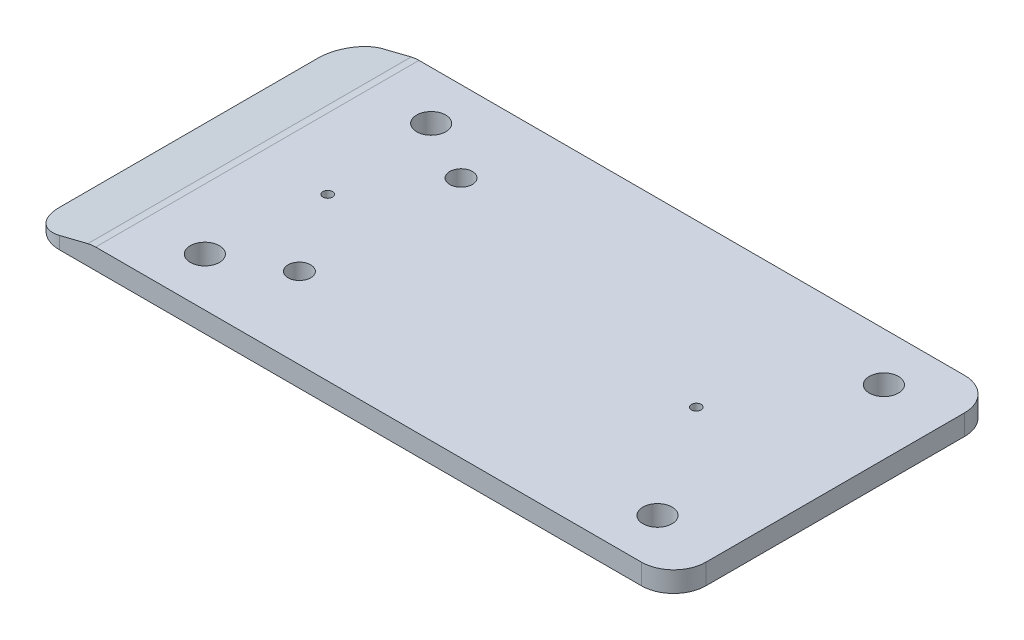
ISO-10303-21;
HEADER;
FILE_DESCRIPTION(('STEP AP214'),'2;1');
FILE_NAME('part.step','',(''),(''),'','','');
FILE_SCHEMA(('AUTOMOTIVE_DESIGN { 1 0 10303 214 1 1 1 1 }'));
ENDSEC;
DATA;
#1=APPLICATION_CONTEXT('core data for automotive mechanical design processes');
#2=APPLICATION_PROTOCOL_DEFINITION('international standard','automotive_design',2000,#1);
#3=PRODUCT_CONTEXT('',#1,'mechanical');
#4=PRODUCT('Part','Part','',(#3));
#5=PRODUCT_RELATED_PRODUCT_CATEGORY('part','',(#4));
#6=PRODUCT_DEFINITION_FORMATION('','',#4);
#7=PRODUCT_DEFINITION_CONTEXT('part definition',#1,'design');
#8=PRODUCT_DEFINITION('design','',#6,#7);
#9=PRODUCT_DEFINITION_SHAPE('','',#8);
#10=(LENGTH_UNIT() NAMED_UNIT(*) SI_UNIT(.MILLI.,.METRE.));
#11=(NAMED_UNIT(*) PLANE_ANGLE_UNIT() SI_UNIT($,.RADIAN.));
#12=(NAMED_UNIT(*) SI_UNIT($,.STERADIAN.) SOLID_ANGLE_UNIT());
#13=UNCERTAINTY_MEASURE_WITH_UNIT(LENGTH_MEASURE(1.E-05),#10,'distance_accuracy_value','');
#14=(GEOMETRIC_REPRESENTATION_CONTEXT(3) GLOBAL_UNCERTAINTY_ASSIGNED_CONTEXT((#13)) GLOBAL_UNIT_ASSIGNED_CONTEXT((#10,
#11,#12)) REPRESENTATION_CONTEXT('',''));
#15=CARTESIAN_POINT('',(0.,0.,0.));
#16=DIRECTION('',(0.,0.,1.));
#17=DIRECTION('',(1.,0.,0.));
#18=AXIS2_PLACEMENT_3D('',#15,#16,#17);
#19=CARTESIAN_POINT('',(100.,6.35,50.));
#20=DIRECTION('',(-1.,0.,0.));
#21=DIRECTION('',(0.,0.,1.));
#22=AXIS2_PLACEMENT_3D('',#19,#20,#21);
#23=PLANE('',#22);
#24=DIRECTION('',(0.,0.,-1.));
#25=VECTOR('',#24,1.);
#26=CARTESIAN_POINT('',(100.,0.,50.));
#27=LINE('',#26,#25);
#28=CARTESIAN_POINT('',(100.,0.,40.));
#29=VERTEX_POINT('',#28);
#30=CARTESIAN_POINT('',(100.,0.,-40.));
#31=VERTEX_POINT('',#30);
#32=EDGE_CURVE('E164',#29,#31,#27,.T.);
#33=ORIENTED_EDGE('',*,*,#32,.T.);
#34=DIRECTION('',(0.,-1.,0.));
#35=VECTOR('',#34,1.);
#36=CARTESIAN_POINT('',(100.,6.35,-40.));
#37=LINE('',#36,#35);
#38=CARTESIAN_POINT('',(100.,6.35,-40.));
#39=VERTEX_POINT('',#38);
#40=EDGE_CURVE('E11',#31,#39,#37,.F.);
#41=ORIENTED_EDGE('',*,*,#40,.T.);
#42=DIRECTION('',(0.,0.,-1.));
#43=VECTOR('',#42,1.);
#44=CARTESIAN_POINT('',(100.,6.35,50.));
#45=LINE('',#44,#43);
#46=CARTESIAN_POINT('',(100.,6.35,40.));
#47=VERTEX_POINT('',#46);
#48=EDGE_CURVE('E126',#47,#39,#45,.T.);
#49=ORIENTED_EDGE('',*,*,#48,.F.);
#50=DIRECTION('',(0.,-1.,0.));
#51=VECTOR('',#50,1.);
#52=CARTESIAN_POINT('',(100.,6.35,40.));
#53=LINE('',#52,#51);
#54=EDGE_CURVE('E48',#47,#29,#53,.T.);
#55=ORIENTED_EDGE('',*,*,#54,.T.);
#56=EDGE_LOOP('',(#33,#41,#49,#55));
#57=FACE_BOUND('',#56,.T.);
#58=ADVANCED_FACE('F40',(#57),#23,.F.);
#59=CARTESIAN_POINT('',(-100.,6.35,-50.));
#60=DIRECTION('',(0.,0.,1.));
#61=DIRECTION('',(1.,0.,0.));
#62=AXIS2_PLACEMENT_3D('',#59,#60,#61);
#63=PLANE('',#62);
#64=DIRECTION('',(-0.970142500145333,-0.24253562503633,0.));
#65=VECTOR('',#64,1.);
#66=CARTESIAN_POINT('',(-79.9999999999997,6.35,-50.));
#67=LINE('',#66,#65);
#68=CARTESIAN_POINT('',(-90.,3.84999999999995,-50.));
#69=VERTEX_POINT('',#68);
#70=CARTESIAN_POINT('',(-81.1942999941864,6.05142500145333,-50.));
#71=VERTEX_POINT('',#70);
#72=EDGE_CURVE('E190',#69,#71,#67,.F.);
#73=ORIENTED_EDGE('',*,*,#72,.T.);
#74=CARTESIAN_POINT('',(-78.7689437438231,-3.65,-50.));
#75=DIRECTION('',(0.,0.,1.));
#76=DIRECTION('',(1.,0.,0.));
#77=AXIS2_PLACEMENT_3D('',#74,#75,#76);
#78=CIRCLE('',#77,10.);
#79=CARTESIAN_POINT('',(-78.7689437438231,6.35,-50.));
#80=VERTEX_POINT('',#79);
#81=EDGE_CURVE('E140',#71,#80,#78,.F.);
#82=ORIENTED_EDGE('',*,*,#81,.T.);
#83=DIRECTION('',(-1.,0.,0.));
#84=VECTOR('',#83,1.);
#85=CARTESIAN_POINT('',(-100.,6.35,-50.));
#86=LINE('',#85,#84);
#87=CARTESIAN_POINT('',(90.,6.35,-50.));
#88=VERTEX_POINT('',#87);
#89=EDGE_CURVE('E123',#88,#80,#86,.T.);
#90=ORIENTED_EDGE('',*,*,#89,.F.);
#91=DIRECTION('',(0.,-1.,0.));
#92=VECTOR('',#91,1.);
#93=CARTESIAN_POINT('',(90.,6.35,-50.));
#94=LINE('',#93,#92);
#95=CARTESIAN_POINT('',(90.,0.,-50.));
#96=VERTEX_POINT('',#95);
#97=EDGE_CURVE('E138',#88,#96,#94,.T.);
#98=ORIENTED_EDGE('',*,*,#97,.T.);
#99=DIRECTION('',(-1.,0.,0.));
#100=VECTOR('',#99,1.);
#101=CARTESIAN_POINT('',(-100.,0.,-50.));
#102=LINE('',#101,#100);
#103=CARTESIAN_POINT('',(-90.,0.,-50.));
#104=VERTEX_POINT('',#103);
#105=EDGE_CURVE('E170',#96,#104,#102,.T.);
#106=ORIENTED_EDGE('',*,*,#105,.T.);
#107=DIRECTION('',(0.,-1.,0.));
#108=VECTOR('',#107,1.);
#109=CARTESIAN_POINT('',(-90.,6.35,-50.));
#110=LINE('',#109,#108);
#111=EDGE_CURVE('E144',#104,#69,#110,.F.);
#112=ORIENTED_EDGE('',*,*,#111,.T.);
#113=EDGE_LOOP('',(#73,#82,#90,#98,#106,#112));
#114=FACE_BOUND('',#113,.T.);
#115=ADVANCED_FACE('F136',(#114),#63,.F.);
#116=CARTESIAN_POINT('',(-100.,6.35,50.));
#117=DIRECTION('',(1.,0.,0.));
#118=DIRECTION('',(0.,0.,-1.));
#119=AXIS2_PLACEMENT_3D('',#116,#117,#118);
#120=PLANE('',#119);
#121=DIRECTION('',(0.,0.,-1.));
#122=VECTOR('',#121,1.);
#123=CARTESIAN_POINT('',(-100.,1.34999999999999,50.));
#124=LINE('',#123,#122);
#125=CARTESIAN_POINT('',(-100.,1.34999999999999,40.));
#126=VERTEX_POINT('',#125);
#127=CARTESIAN_POINT('',(-100.,1.34999999999999,-40.));
#128=VERTEX_POINT('',#127);
#129=EDGE_CURVE('E187',#126,#128,#124,.T.);
#130=ORIENTED_EDGE('',*,*,#129,.T.);
#131=DIRECTION('',(0.,-1.,0.));
#132=VECTOR('',#131,1.);
#133=CARTESIAN_POINT('',(-100.,6.35,-40.));
#134=LINE('',#133,#132);
#135=CARTESIAN_POINT('',(-100.,0.,-40.));
#136=VERTEX_POINT('',#135);
#137=EDGE_CURVE('E155',#128,#136,#134,.T.);
#138=ORIENTED_EDGE('',*,*,#137,.T.);
#139=DIRECTION('',(0.,0.,1.));
#140=VECTOR('',#139,1.);
#141=CARTESIAN_POINT('',(-100.,0.,50.));
#142=LINE('',#141,#140);
#143=CARTESIAN_POINT('',(-100.,0.,40.));
#144=VERTEX_POINT('',#143);
#145=EDGE_CURVE('E173',#136,#144,#142,.T.);
#146=ORIENTED_EDGE('',*,*,#145,.T.);
#147=DIRECTION('',(0.,-1.,0.));
#148=VECTOR('',#147,1.);
#149=CARTESIAN_POINT('',(-100.,6.35,40.));
#150=LINE('',#149,#148);
#151=EDGE_CURVE('E153',#144,#126,#150,.F.);
#152=ORIENTED_EDGE('',*,*,#151,.T.);
#153=EDGE_LOOP('',(#130,#138,#146,#152));
#154=FACE_BOUND('',#153,.T.);
#155=ADVANCED_FACE('F213',(#154),#120,.F.);
#156=CARTESIAN_POINT('',(-100.,6.35,50.));
#157=DIRECTION('',(0.,0.,-1.));
#158=DIRECTION('',(-1.,0.,0.));
#159=AXIS2_PLACEMENT_3D('',#156,#157,#158);
#160=PLANE('',#159);
#161=DIRECTION('',(1.,0.,0.));
#162=VECTOR('',#161,1.);
#163=CARTESIAN_POINT('',(-100.,6.35,50.));
#164=LINE('',#163,#162);
#165=CARTESIAN_POINT('',(-78.7689437438231,6.35,50.));
#166=VERTEX_POINT('',#165);
#167=CARTESIAN_POINT('',(90.,6.35,50.));
#168=VERTEX_POINT('',#167);
#169=EDGE_CURVE('E141',#166,#168,#164,.T.);
#170=ORIENTED_EDGE('',*,*,#169,.F.);
#171=CARTESIAN_POINT('',(-78.7689437438231,-3.65,50.));
#172=DIRECTION('',(0.,0.,-1.));
#173=DIRECTION('',(-1.,0.,0.));
#174=AXIS2_PLACEMENT_3D('',#171,#172,#173);
#175=CIRCLE('',#174,10.);
#176=CARTESIAN_POINT('',(-81.1942999941864,6.05142500145333,50.));
#177=VERTEX_POINT('',#176);
#178=EDGE_CURVE('E199',#166,#177,#175,.F.);
#179=ORIENTED_EDGE('',*,*,#178,.T.);
#180=DIRECTION('',(0.970142500145333,0.24253562503633,0.));
#181=VECTOR('',#180,1.);
#182=CARTESIAN_POINT('',(-79.9999999999997,6.35,50.));
#183=LINE('',#182,#181);
#184=CARTESIAN_POINT('',(-90.,3.84999999999995,50.));
#185=VERTEX_POINT('',#184);
#186=EDGE_CURVE('E184',#177,#185,#183,.F.);
#187=ORIENTED_EDGE('',*,*,#186,.T.);
#188=DIRECTION('',(0.,-1.,0.));
#189=VECTOR('',#188,1.);
#190=CARTESIAN_POINT('',(-90.,6.35,50.));
#191=LINE('',#190,#189);
#192=CARTESIAN_POINT('',(-90.,0.,50.));
#193=VERTEX_POINT('',#192);
#194=EDGE_CURVE('E194',#185,#193,#191,.T.);
#195=ORIENTED_EDGE('',*,*,#194,.T.);
#196=DIRECTION('',(1.,0.,0.));
#197=VECTOR('',#196,1.);
#198=CARTESIAN_POINT('',(-100.,0.,50.));
#199=LINE('',#198,#197);
#200=CARTESIAN_POINT('',(90.,0.,50.));
#201=VERTEX_POINT('',#200);
#202=EDGE_CURVE('E182',#193,#201,#199,.T.);
#203=ORIENTED_EDGE('',*,*,#202,.T.);
#204=DIRECTION('',(0.,-1.,0.));
#205=VECTOR('',#204,1.);
#206=CARTESIAN_POINT('',(90.,6.35,50.));
#207=LINE('',#206,#205);
#208=EDGE_CURVE('E197',#201,#168,#207,.F.);
#209=ORIENTED_EDGE('',*,*,#208,.T.);
#210=EDGE_LOOP('',(#170,#179,#187,#195,#203,#209));
#211=FACE_BOUND('',#210,.T.);
#212=ADVANCED_FACE('F222',(#211),#160,.F.);
#213=CARTESIAN_POINT('',(0.,6.35,0.));
#214=DIRECTION('',(0.,-1.,0.));
#215=DIRECTION('',(0.,0.,-1.));
#216=AXIS2_PLACEMENT_3D('',#213,#214,#215);
#217=PLANE('',#216);
#218=CARTESIAN_POINT('',(-40.7689437438231,6.35,-25.));
#219=DIRECTION('',(0.,1.,0.));
#220=DIRECTION('',(0.,0.,1.));
#221=AXIS2_PLACEMENT_3D('',#218,#219,#220);
#222=CIRCLE('',#221,3.5);
#223=CARTESIAN_POINT('',(-40.7689437438231,6.35,-21.5));
#224=VERTEX_POINT('',#223);
#225=EDGE_CURVE('E410',#224,#224,#222,.T.);
#226=ORIENTED_EDGE('',*,*,#225,.F.);
#227=EDGE_LOOP('',(#226));
#228=FACE_BOUND('',#227,.T.);
#229=CARTESIAN_POINT('',(-40.7689437438231,6.35,25.));
#230=DIRECTION('',(0.,1.,0.));
#231=DIRECTION('',(0.,0.,1.));
#232=AXIS2_PLACEMENT_3D('',#229,#230,#231);
#233=CIRCLE('',#232,3.5);
#234=CARTESIAN_POINT('',(-40.7689437438231,6.35,28.5));
#235=VERTEX_POINT('',#234);
#236=EDGE_CURVE('E412',#235,#235,#233,.T.);
#237=ORIENTED_EDGE('',*,*,#236,.F.);
#238=EDGE_LOOP('',(#237));
#239=FACE_BOUND('',#238,.T.);
#240=CARTESIAN_POINT('',(-60.,6.35,-35.));
#241=DIRECTION('',(0.,1.,0.));
#242=DIRECTION('',(0.,0.,1.));
#243=AXIS2_PLACEMENT_3D('',#240,#241,#242);
#244=CIRCLE('',#243,4.5);
#245=CARTESIAN_POINT('',(-60.,6.35,-30.5));
#246=VERTEX_POINT('',#245);
#247=EDGE_CURVE('E420',#246,#246,#244,.T.);
#248=ORIENTED_EDGE('',*,*,#247,.F.);
#249=EDGE_LOOP('',(#248));
#250=FACE_BOUND('',#249,.T.);
#251=CARTESIAN_POINT('',(80.,6.35,35.));
#252=DIRECTION('',(0.,1.,0.));
#253=DIRECTION('',(0.,0.,1.));
#254=AXIS2_PLACEMENT_3D('',#251,#252,#253);
#255=CIRCLE('',#254,4.5);
#256=CARTESIAN_POINT('',(80.,6.35,39.5));
#257=VERTEX_POINT('',#256);
#258=EDGE_CURVE('E426',#257,#257,#255,.T.);
#259=ORIENTED_EDGE('',*,*,#258,.F.);
#260=EDGE_LOOP('',(#259));
#261=FACE_BOUND('',#260,.T.);
#262=CARTESIAN_POINT('',(-60.,6.35,35.));
#263=DIRECTION('',(0.,1.,0.));
#264=DIRECTION('',(0.,0.,1.));
#265=AXIS2_PLACEMENT_3D('',#262,#263,#264);
#266=CIRCLE('',#265,4.5);
#267=CARTESIAN_POINT('',(-60.,6.35,39.5));
#268=VERTEX_POINT('',#267);
#269=EDGE_CURVE('E432',#268,#268,#266,.T.);
#270=ORIENTED_EDGE('',*,*,#269,.F.);
#271=EDGE_LOOP('',(#270));
#272=FACE_BOUND('',#271,.T.);
#273=CARTESIAN_POINT('',(80.,6.35,-35.));
#274=DIRECTION('',(0.,1.,0.));
#275=DIRECTION('',(0.,0.,1.));
#276=AXIS2_PLACEMENT_3D('',#273,#274,#275);
#277=CIRCLE('',#276,4.5);
#278=CARTESIAN_POINT('',(80.,6.35,-30.5));
#279=VERTEX_POINT('',#278);
#280=EDGE_CURVE('E438',#279,#279,#277,.T.);
#281=ORIENTED_EDGE('',*,*,#280,.F.);
#282=EDGE_LOOP('',(#281));
#283=FACE_BOUND('',#282,.T.);
#284=CARTESIAN_POINT('',(57.,6.35,0.));
#285=DIRECTION('',(0.,1.,0.));
#286=DIRECTION('',(0.,0.,1.));
#287=AXIS2_PLACEMENT_3D('',#284,#285,#286);
#288=CIRCLE('',#287,1.5);
#289=CARTESIAN_POINT('',(57.,6.35,1.5));
#290=VERTEX_POINT('',#289);
#291=EDGE_CURVE('E444',#290,#290,#288,.T.);
#292=ORIENTED_EDGE('',*,*,#291,.F.);
#293=EDGE_LOOP('',(#292));
#294=FACE_BOUND('',#293,.T.);
#295=CARTESIAN_POINT('',(-57.,6.35,0.));
#296=DIRECTION('',(0.,1.,0.));
#297=DIRECTION('',(0.,0.,1.));
#298=AXIS2_PLACEMENT_3D('',#295,#296,#297);
#299=CIRCLE('',#298,1.5);
#300=CARTESIAN_POINT('',(-57.,6.35,1.5));
#301=VERTEX_POINT('',#300);
#302=EDGE_CURVE('E176',#301,#301,#299,.T.);
#303=ORIENTED_EDGE('',*,*,#302,.F.);
#304=EDGE_LOOP('',(#303));
#305=FACE_BOUND('',#304,.T.);
#306=ORIENTED_EDGE('',*,*,#89,.T.);
#307=DIRECTION('',(0.,0.,-1.));
#308=VECTOR('',#307,1.);
#309=CARTESIAN_POINT('',(-78.7689437438231,6.35,50.));
#310=LINE('',#309,#308);
#311=EDGE_CURVE('E130',#80,#166,#310,.F.);
#312=ORIENTED_EDGE('',*,*,#311,.T.);
#313=ORIENTED_EDGE('',*,*,#169,.T.);
#314=CARTESIAN_POINT('',(90.,6.35,40.));
#315=DIRECTION('',(0.,-1.,0.));
#316=DIRECTION('',(0.,0.,-1.));
#317=AXIS2_PLACEMENT_3D('',#314,#315,#316);
#318=CIRCLE('',#317,10.);
#319=EDGE_CURVE('E131',#168,#47,#318,.F.);
#320=ORIENTED_EDGE('',*,*,#319,.T.);
#321=ORIENTED_EDGE('',*,*,#48,.T.);
#322=CARTESIAN_POINT('',(90.,6.35,-40.));
#323=DIRECTION('',(0.,-1.,0.));
#324=DIRECTION('',(0.,0.,-1.));
#325=AXIS2_PLACEMENT_3D('',#322,#323,#324);
#326=CIRCLE('',#325,10.);
#327=EDGE_CURVE('E119',#39,#88,#326,.F.);
#328=ORIENTED_EDGE('',*,*,#327,.T.);
#329=EDGE_LOOP('',(#306,#312,#313,#320,#321,#328));
#330=FACE_BOUND('',#329,.T.);
#331=ADVANCED_FACE('F121',(#228,#239,#250,#261,#272,#283,#294,#305,#330),#217,.F.);
#332=CARTESIAN_POINT('',(0.,0.,0.));
#333=DIRECTION('',(0.,-1.,0.));
#334=DIRECTION('',(0.,0.,-1.));
#335=AXIS2_PLACEMENT_3D('',#332,#333,#334);
#336=PLANE('',#335);
#337=CARTESIAN_POINT('',(-40.7689437438231,0.,-25.));
#338=DIRECTION('',(0.,1.,0.));
#339=DIRECTION('',(0.,0.,1.));
#340=AXIS2_PLACEMENT_3D('',#337,#338,#339);
#341=CIRCLE('',#340,3.5);
#342=CARTESIAN_POINT('',(-40.7689437438231,0.,-21.5));
#343=VERTEX_POINT('',#342);
#344=EDGE_CURVE('E407',#343,#343,#341,.T.);
#345=ORIENTED_EDGE('',*,*,#344,.T.);
#346=EDGE_LOOP('',(#345));
#347=FACE_BOUND('',#346,.T.);
#348=CARTESIAN_POINT('',(-40.7689437438231,0.,25.));
#349=DIRECTION('',(0.,1.,0.));
#350=DIRECTION('',(0.,0.,1.));
#351=AXIS2_PLACEMENT_3D('',#348,#349,#350);
#352=CIRCLE('',#351,3.5);
#353=CARTESIAN_POINT('',(-40.7689437438231,0.,28.5));
#354=VERTEX_POINT('',#353);
#355=EDGE_CURVE('E417',#354,#354,#352,.T.);
#356=ORIENTED_EDGE('',*,*,#355,.T.);
#357=EDGE_LOOP('',(#356));
#358=FACE_BOUND('',#357,.T.);
#359=CARTESIAN_POINT('',(-60.,0.,-35.));
#360=DIRECTION('',(0.,1.,0.));
#361=DIRECTION('',(0.,0.,1.));
#362=AXIS2_PLACEMENT_3D('',#359,#360,#361);
#363=CIRCLE('',#362,4.5);
#364=CARTESIAN_POINT('',(-60.,0.,-30.5));
#365=VERTEX_POINT('',#364);
#366=EDGE_CURVE('E423',#365,#365,#363,.T.);
#367=ORIENTED_EDGE('',*,*,#366,.T.);
#368=EDGE_LOOP('',(#367));
#369=FACE_BOUND('',#368,.T.);
#370=CARTESIAN_POINT('',(80.,0.,35.));
#371=DIRECTION('',(0.,1.,0.));
#372=DIRECTION('',(0.,0.,1.));
#373=AXIS2_PLACEMENT_3D('',#370,#371,#372);
#374=CIRCLE('',#373,4.5);
#375=CARTESIAN_POINT('',(80.,0.,39.5));
#376=VERTEX_POINT('',#375);
#377=EDGE_CURVE('E429',#376,#376,#374,.T.);
#378=ORIENTED_EDGE('',*,*,#377,.T.);
#379=EDGE_LOOP('',(#378));
#380=FACE_BOUND('',#379,.T.);
#381=CARTESIAN_POINT('',(-60.,0.,35.));
#382=DIRECTION('',(0.,1.,0.));
#383=DIRECTION('',(0.,0.,1.));
#384=AXIS2_PLACEMENT_3D('',#381,#382,#383);
#385=CIRCLE('',#384,4.5);
#386=CARTESIAN_POINT('',(-60.,0.,39.5));
#387=VERTEX_POINT('',#386);
#388=EDGE_CURVE('E435',#387,#387,#385,.T.);
#389=ORIENTED_EDGE('',*,*,#388,.T.);
#390=EDGE_LOOP('',(#389));
#391=FACE_BOUND('',#390,.T.);
#392=CARTESIAN_POINT('',(80.,0.,-35.));
#393=DIRECTION('',(0.,1.,0.));
#394=DIRECTION('',(0.,0.,1.));
#395=AXIS2_PLACEMENT_3D('',#392,#393,#394);
#396=CIRCLE('',#395,4.5);
#397=CARTESIAN_POINT('',(80.,0.,-30.5));
#398=VERTEX_POINT('',#397);
#399=EDGE_CURVE('E441',#398,#398,#396,.T.);
#400=ORIENTED_EDGE('',*,*,#399,.T.);
#401=EDGE_LOOP('',(#400));
#402=FACE_BOUND('',#401,.T.);
#403=CARTESIAN_POINT('',(57.,0.,0.));
#404=DIRECTION('',(0.,1.,0.));
#405=DIRECTION('',(0.,0.,1.));
#406=AXIS2_PLACEMENT_3D('',#403,#404,#405);
#407=CIRCLE('',#406,1.5);
#408=CARTESIAN_POINT('',(57.,0.,1.5));
#409=VERTEX_POINT('',#408);
#410=EDGE_CURVE('E447',#409,#409,#407,.T.);
#411=ORIENTED_EDGE('',*,*,#410,.T.);
#412=EDGE_LOOP('',(#411));
#413=FACE_BOUND('',#412,.T.);
#414=CARTESIAN_POINT('',(-57.,0.,0.));
#415=DIRECTION('',(0.,1.,0.));
#416=DIRECTION('',(0.,0.,1.));
#417=AXIS2_PLACEMENT_3D('',#414,#415,#416);
#418=CIRCLE('',#417,1.5);
#419=CARTESIAN_POINT('',(-57.,0.,1.5));
#420=VERTEX_POINT('',#419);
#421=EDGE_CURVE('E171',#420,#420,#418,.T.);
#422=ORIENTED_EDGE('',*,*,#421,.T.);
#423=EDGE_LOOP('',(#422));
#424=FACE_BOUND('',#423,.T.);
#425=ORIENTED_EDGE('',*,*,#145,.F.);
#426=CARTESIAN_POINT('',(-90.,0.,-40.));
#427=DIRECTION('',(0.,-1.,0.));
#428=DIRECTION('',(0.,0.,-1.));
#429=AXIS2_PLACEMENT_3D('',#426,#427,#428);
#430=CIRCLE('',#429,10.);
#431=EDGE_CURVE('E162',#136,#104,#430,.T.);
#432=ORIENTED_EDGE('',*,*,#431,.T.);
#433=ORIENTED_EDGE('',*,*,#105,.F.);
#434=CARTESIAN_POINT('',(90.,0.,-40.));
#435=DIRECTION('',(0.,-1.,0.));
#436=DIRECTION('',(0.,0.,-1.));
#437=AXIS2_PLACEMENT_3D('',#434,#435,#436);
#438=CIRCLE('',#437,10.);
#439=EDGE_CURVE('E55',#96,#31,#438,.T.);
#440=ORIENTED_EDGE('',*,*,#439,.T.);
#441=ORIENTED_EDGE('',*,*,#32,.F.);
#442=CARTESIAN_POINT('',(90.,0.,40.));
#443=DIRECTION('',(0.,-1.,0.));
#444=DIRECTION('',(0.,0.,-1.));
#445=AXIS2_PLACEMENT_3D('',#442,#443,#444);
#446=CIRCLE('',#445,10.);
#447=EDGE_CURVE('E63',#29,#201,#446,.T.);
#448=ORIENTED_EDGE('',*,*,#447,.T.);
#449=ORIENTED_EDGE('',*,*,#202,.F.);
#450=CARTESIAN_POINT('',(-90.,0.,40.));
#451=DIRECTION('',(0.,-1.,0.));
#452=DIRECTION('',(0.,0.,-1.));
#453=AXIS2_PLACEMENT_3D('',#450,#451,#452);
#454=CIRCLE('',#453,10.);
#455=EDGE_CURVE('E158',#193,#144,#454,.T.);
#456=ORIENTED_EDGE('',*,*,#455,.T.);
#457=EDGE_LOOP('',(#425,#432,#433,#440,#441,#448,#449,#456));
#458=FACE_BOUND('',#457,.T.);
#459=ADVANCED_FACE('F167',(#347,#358,#369,#380,#391,#402,#413,#424,#458),#336,.T.);
#460=CARTESIAN_POINT('',(-79.9999999999997,6.35,0.));
#461=DIRECTION('',(0.24253562503633,-0.970142500145333,0.));
#462=DIRECTION('',(0.,0.,1.));
#463=AXIS2_PLACEMENT_3D('',#460,#461,#462);
#464=PLANE('',#463);
#465=ORIENTED_EDGE('',*,*,#186,.F.);
#466=DIRECTION('',(0.,0.,1.));
#467=VECTOR('',#466,1.);
#468=CARTESIAN_POINT('',(-81.1942999941864,6.05142500145333,-50.));
#469=LINE('',#468,#467);
#470=EDGE_CURVE('E145',#177,#71,#469,.F.);
#471=ORIENTED_EDGE('',*,*,#470,.T.);
#472=ORIENTED_EDGE('',*,*,#72,.F.);
#473=CARTESIAN_POINT('',(-90.,3.84999999999995,-40.));
#474=DIRECTION('',(0.24253562503633,-0.970142500145333,0.));
#475=DIRECTION('',(-0.970142500145333,-0.24253562503633,0.));
#476=AXIS2_PLACEMENT_3D('',#473,#474,#475);
#477=ELLIPSE('',#476,10.3077640640441,10.);
#478=EDGE_CURVE('E148',#69,#128,#477,.F.);
#479=ORIENTED_EDGE('',*,*,#478,.T.);
#480=ORIENTED_EDGE('',*,*,#129,.F.);
#481=CARTESIAN_POINT('',(-90.,3.84999999999995,40.));
#482=DIRECTION('',(0.24253562503633,-0.970142500145333,0.));
#483=DIRECTION('',(-0.970142500145333,-0.24253562503633,0.));
#484=AXIS2_PLACEMENT_3D('',#481,#482,#483);
#485=ELLIPSE('',#484,10.3077640640441,10.);
#486=EDGE_CURVE('E201',#126,#185,#485,.F.);
#487=ORIENTED_EDGE('',*,*,#486,.T.);
#488=EDGE_LOOP('',(#465,#471,#472,#479,#480,#487));
#489=FACE_BOUND('',#488,.T.);
#490=ADVANCED_FACE('F207',(#489),#464,.F.);
#491=CARTESIAN_POINT('',(-78.7689437438231,-3.65,0.));
#492=DIRECTION('',(0.,0.,1.));
#493=DIRECTION('',(1.,0.,0.));
#494=AXIS2_PLACEMENT_3D('',#491,#492,#493);
#495=CYLINDRICAL_SURFACE('',#494,10.);
#496=ORIENTED_EDGE('',*,*,#81,.F.);
#497=ORIENTED_EDGE('',*,*,#470,.F.);
#498=ORIENTED_EDGE('',*,*,#178,.F.);
#499=ORIENTED_EDGE('',*,*,#311,.F.);
#500=EDGE_LOOP('',(#496,#497,#498,#499));
#501=FACE_BOUND('',#500,.T.);
#502=ADVANCED_FACE('F218',(#501),#495,.T.);
#503=CARTESIAN_POINT('',(-90.,6.35,-40.));
#504=DIRECTION('',(0.,-1.,0.));
#505=DIRECTION('',(0.,0.,-1.));
#506=AXIS2_PLACEMENT_3D('',#503,#504,#505);
#507=CYLINDRICAL_SURFACE('',#506,10.);
#508=ORIENTED_EDGE('',*,*,#478,.F.);
#509=ORIENTED_EDGE('',*,*,#111,.F.);
#510=ORIENTED_EDGE('',*,*,#431,.F.);
#511=ORIENTED_EDGE('',*,*,#137,.F.);
#512=EDGE_LOOP('',(#508,#509,#510,#511));
#513=FACE_BOUND('',#512,.T.);
#514=ADVANCED_FACE('F215',(#513),#507,.T.);
#515=CARTESIAN_POINT('',(90.,6.35,-40.));
#516=DIRECTION('',(0.,-1.,0.));
#517=DIRECTION('',(0.,0.,-1.));
#518=AXIS2_PLACEMENT_3D('',#515,#516,#517);
#519=CYLINDRICAL_SURFACE('',#518,10.);
#520=ORIENTED_EDGE('',*,*,#327,.F.);
#521=ORIENTED_EDGE('',*,*,#40,.F.);
#522=ORIENTED_EDGE('',*,*,#439,.F.);
#523=ORIENTED_EDGE('',*,*,#97,.F.);
#524=EDGE_LOOP('',(#520,#521,#522,#523));
#525=FACE_BOUND('',#524,.T.);
#526=ADVANCED_FACE('F143',(#525),#519,.T.);
#527=CARTESIAN_POINT('',(90.,6.35,40.));
#528=DIRECTION('',(0.,-1.,0.));
#529=DIRECTION('',(0.,0.,-1.));
#530=AXIS2_PLACEMENT_3D('',#527,#528,#529);
#531=CYLINDRICAL_SURFACE('',#530,10.);
#532=ORIENTED_EDGE('',*,*,#319,.F.);
#533=ORIENTED_EDGE('',*,*,#208,.F.);
#534=ORIENTED_EDGE('',*,*,#447,.F.);
#535=ORIENTED_EDGE('',*,*,#54,.F.);
#536=EDGE_LOOP('',(#532,#533,#534,#535));
#537=FACE_BOUND('',#536,.T.);
#538=ADVANCED_FACE('F223',(#537),#531,.T.);
#539=CARTESIAN_POINT('',(-90.,6.35,40.));
#540=DIRECTION('',(0.,-1.,0.));
#541=DIRECTION('',(0.,0.,-1.));
#542=AXIS2_PLACEMENT_3D('',#539,#540,#541);
#543=CYLINDRICAL_SURFACE('',#542,10.);
#544=ORIENTED_EDGE('',*,*,#486,.F.);
#545=ORIENTED_EDGE('',*,*,#151,.F.);
#546=ORIENTED_EDGE('',*,*,#455,.F.);
#547=ORIENTED_EDGE('',*,*,#194,.F.);
#548=EDGE_LOOP('',(#544,#545,#546,#547));
#549=FACE_BOUND('',#548,.T.);
#550=ADVANCED_FACE('F42',(#549),#543,.T.);
#551=CARTESIAN_POINT('',(-57.,6.35,0.));
#552=DIRECTION('',(0.,1.,0.));
#553=DIRECTION('',(0.,0.,1.));
#554=AXIS2_PLACEMENT_3D('',#551,#552,#553);
#555=CYLINDRICAL_SURFACE('',#554,1.5);
#556=ORIENTED_EDGE('',*,*,#421,.F.);
#557=EDGE_LOOP('',(#556));
#558=FACE_BOUND('',#557,.T.);
#559=ORIENTED_EDGE('',*,*,#302,.T.);
#560=EDGE_LOOP('',(#559));
#561=FACE_BOUND('',#560,.T.);
#562=ADVANCED_FACE('F229',(#558,#561),#555,.F.);
#563=CARTESIAN_POINT('',(57.,6.35,0.));
#564=DIRECTION('',(0.,1.,0.));
#565=DIRECTION('',(0.,0.,1.));
#566=AXIS2_PLACEMENT_3D('',#563,#564,#565);
#567=CYLINDRICAL_SURFACE('',#566,1.5);
#568=ORIENTED_EDGE('',*,*,#410,.F.);
#569=EDGE_LOOP('',(#568));
#570=FACE_BOUND('',#569,.T.);
#571=ORIENTED_EDGE('',*,*,#291,.T.);
#572=EDGE_LOOP('',(#571));
#573=FACE_BOUND('',#572,.T.);
#574=ADVANCED_FACE('F275',(#570,#573),#567,.F.);
#575=CARTESIAN_POINT('',(80.,6.35,-35.));
#576=DIRECTION('',(0.,1.,0.));
#577=DIRECTION('',(0.,0.,1.));
#578=AXIS2_PLACEMENT_3D('',#575,#576,#577);
#579=CYLINDRICAL_SURFACE('',#578,4.5);
#580=ORIENTED_EDGE('',*,*,#399,.F.);
#581=EDGE_LOOP('',(#580));
#582=FACE_BOUND('',#581,.T.);
#583=ORIENTED_EDGE('',*,*,#280,.T.);
#584=EDGE_LOOP('',(#583));
#585=FACE_BOUND('',#584,.T.);
#586=ADVANCED_FACE('F285',(#582,#585),#579,.F.);
#587=CARTESIAN_POINT('',(-60.,6.35,35.));
#588=DIRECTION('',(0.,1.,0.));
#589=DIRECTION('',(0.,0.,1.));
#590=AXIS2_PLACEMENT_3D('',#587,#588,#589);
#591=CYLINDRICAL_SURFACE('',#590,4.5);
#592=ORIENTED_EDGE('',*,*,#388,.F.);
#593=EDGE_LOOP('',(#592));
#594=FACE_BOUND('',#593,.T.);
#595=ORIENTED_EDGE('',*,*,#269,.T.);
#596=EDGE_LOOP('',(#595));
#597=FACE_BOUND('',#596,.T.);
#598=ADVANCED_FACE('F295',(#594,#597),#591,.F.);
#599=CARTESIAN_POINT('',(80.,6.35,35.));
#600=DIRECTION('',(0.,1.,0.));
#601=DIRECTION('',(0.,0.,1.));
#602=AXIS2_PLACEMENT_3D('',#599,#600,#601);
#603=CYLINDRICAL_SURFACE('',#602,4.5);
#604=ORIENTED_EDGE('',*,*,#377,.F.);
#605=EDGE_LOOP('',(#604));
#606=FACE_BOUND('',#605,.T.);
#607=ORIENTED_EDGE('',*,*,#258,.T.);
#608=EDGE_LOOP('',(#607));
#609=FACE_BOUND('',#608,.T.);
#610=ADVANCED_FACE('F305',(#606,#609),#603,.F.);
#611=CARTESIAN_POINT('',(-60.,6.35,-35.));
#612=DIRECTION('',(0.,1.,0.));
#613=DIRECTION('',(0.,0.,1.));
#614=AXIS2_PLACEMENT_3D('',#611,#612,#613);
#615=CYLINDRICAL_SURFACE('',#614,4.5);
#616=ORIENTED_EDGE('',*,*,#366,.F.);
#617=EDGE_LOOP('',(#616));
#618=FACE_BOUND('',#617,.T.);
#619=ORIENTED_EDGE('',*,*,#247,.T.);
#620=EDGE_LOOP('',(#619));
#621=FACE_BOUND('',#620,.T.);
#622=ADVANCED_FACE('F315',(#618,#621),#615,.F.);
#623=CARTESIAN_POINT('',(-40.7689437438231,6.35,25.));
#624=DIRECTION('',(0.,1.,0.));
#625=DIRECTION('',(0.,0.,1.));
#626=AXIS2_PLACEMENT_3D('',#623,#624,#625);
#627=CYLINDRICAL_SURFACE('',#626,3.5);
#628=ORIENTED_EDGE('',*,*,#355,.F.);
#629=EDGE_LOOP('',(#628));
#630=FACE_BOUND('',#629,.T.);
#631=ORIENTED_EDGE('',*,*,#236,.T.);
#632=EDGE_LOOP('',(#631));
#633=FACE_BOUND('',#632,.T.);
#634=ADVANCED_FACE('F325',(#630,#633),#627,.F.);
#635=CARTESIAN_POINT('',(-40.7689437438231,6.35,-25.));
#636=DIRECTION('',(0.,1.,0.));
#637=DIRECTION('',(0.,0.,1.));
#638=AXIS2_PLACEMENT_3D('',#635,#636,#637);
#639=CYLINDRICAL_SURFACE('',#638,3.5);
#640=ORIENTED_EDGE('',*,*,#344,.F.);
#641=EDGE_LOOP('',(#640));
#642=FACE_BOUND('',#641,.T.);
#643=ORIENTED_EDGE('',*,*,#225,.T.);
#644=EDGE_LOOP('',(#643));
#645=FACE_BOUND('',#644,.T.);
#646=ADVANCED_FACE('F356',(#642,#645),#639,.F.);
#647=CLOSED_SHELL('',(#58,#115,#155,#212,#331,#459,#490,#502,#514,#526,#538,#550,#562,#574,#586,
#598,#610,#622,#634,#646));
#648=MANIFOLD_SOLID_BREP('B2',#647);
#649=ADVANCED_BREP_SHAPE_REPRESENTATION('',(#18,#648),#14);
#650=SHAPE_DEFINITION_REPRESENTATION(#9,#649);
ENDSEC;
END-ISO-10303-21;
